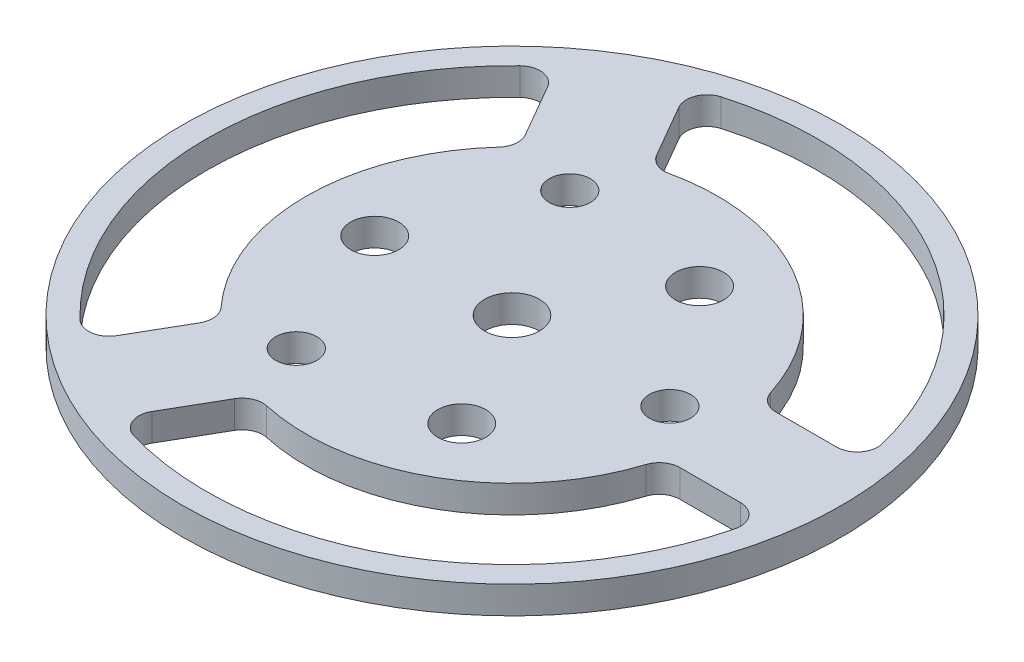
ISO-10303-21;
HEADER;
FILE_DESCRIPTION(('STEP AP214'),'2;1');
FILE_NAME('part.step','',(''),(''),'','','');
FILE_SCHEMA(('AUTOMOTIVE_DESIGN { 1 0 10303 214 1 1 1 1 }'));
ENDSEC;
DATA;
#1=APPLICATION_CONTEXT('core data for automotive mechanical design processes');
#2=APPLICATION_PROTOCOL_DEFINITION('international standard','automotive_design',2000,#1);
#3=PRODUCT_CONTEXT('',#1,'mechanical');
#4=PRODUCT('Part','Part','',(#3));
#5=PRODUCT_RELATED_PRODUCT_CATEGORY('part','',(#4));
#6=PRODUCT_DEFINITION_FORMATION('','',#4);
#7=PRODUCT_DEFINITION_CONTEXT('part definition',#1,'design');
#8=PRODUCT_DEFINITION('design','',#6,#7);
#9=PRODUCT_DEFINITION_SHAPE('','',#8);
#10=(LENGTH_UNIT() NAMED_UNIT(*) SI_UNIT(.MILLI.,.METRE.));
#11=(NAMED_UNIT(*) PLANE_ANGLE_UNIT() SI_UNIT($,.RADIAN.));
#12=(NAMED_UNIT(*) SI_UNIT($,.STERADIAN.) SOLID_ANGLE_UNIT());
#13=UNCERTAINTY_MEASURE_WITH_UNIT(LENGTH_MEASURE(1.E-05),#10,'distance_accuracy_value','');
#14=(GEOMETRIC_REPRESENTATION_CONTEXT(3) GLOBAL_UNCERTAINTY_ASSIGNED_CONTEXT((#13)) GLOBAL_UNIT_ASSIGNED_CONTEXT((#10,
#11,#12)) REPRESENTATION_CONTEXT('',''));
#15=CARTESIAN_POINT('',(0.,0.,0.));
#16=DIRECTION('',(0.,0.,1.));
#17=DIRECTION('',(1.,0.,0.));
#18=AXIS2_PLACEMENT_3D('',#15,#16,#17);
#19=CARTESIAN_POINT('',(0.,2.,0.));
#20=DIRECTION('',(0.,1.,0.));
#21=DIRECTION('',(0.,0.,1.));
#22=AXIS2_PLACEMENT_3D('',#19,#20,#21);
#23=PLANE('',#22);
#24=CARTESIAN_POINT('',(5.,2.,-8.66025403784439));
#25=DIRECTION('',(0.,1.,0.));
#26=DIRECTION('',(0.,0.,1.));
#27=AXIS2_PLACEMENT_3D('',#24,#25,#26);
#28=CIRCLE('',#27,1.75);
#29=CARTESIAN_POINT('',(5.,2.,-6.91025403784439));
#30=VERTEX_POINT('',#29);
#31=EDGE_CURVE('E365',#30,#30,#28,.T.);
#32=ORIENTED_EDGE('',*,*,#31,.F.);
#33=EDGE_LOOP('',(#32));
#34=FACE_BOUND('',#33,.T.);
#35=CARTESIAN_POINT('',(5.0000000000005,2.,8.66025403784439));
#36=DIRECTION('',(0.,1.,0.));
#37=DIRECTION('',(0.,0.,1.));
#38=AXIS2_PLACEMENT_3D('',#35,#36,#37);
#39=CIRCLE('',#38,1.75000000000014);
#40=CARTESIAN_POINT('',(5.0000000000005,2.,10.4102540378445));
#41=VERTEX_POINT('',#40);
#42=EDGE_CURVE('E536',#41,#41,#39,.T.);
#43=ORIENTED_EDGE('',*,*,#42,.F.);
#44=EDGE_LOOP('',(#43));
#45=FACE_BOUND('',#44,.T.);
#46=CARTESIAN_POINT('',(-9.99999999999975,2.,4.32252444309614E-13));
#47=DIRECTION('',(0.,1.,0.));
#48=DIRECTION('',(0.,0.,1.));
#49=AXIS2_PLACEMENT_3D('',#46,#47,#48);
#50=CIRCLE('',#49,1.75000000000053);
#51=CARTESIAN_POINT('',(-9.99999999999975,2.,1.75000000000096));
#52=VERTEX_POINT('',#51);
#53=EDGE_CURVE('E533',#52,#52,#50,.T.);
#54=ORIENTED_EDGE('',*,*,#53,.F.);
#55=EDGE_LOOP('',(#54));
#56=FACE_BOUND('',#55,.T.);
#57=CARTESIAN_POINT('',(0.,2.,0.));
#58=DIRECTION('',(0.,1.,0.));
#59=DIRECTION('',(0.,0.,1.));
#60=AXIS2_PLACEMENT_3D('',#57,#58,#59);
#61=CIRCLE('',#60,22.25);
#62=CARTESIAN_POINT('',(21.5943835085545,2.,-5.36144578313253));
#63=VERTEX_POINT('',#62);
#64=CARTESIAN_POINT('',(-6.15404350507153,2.,-21.3820075890382));
#65=VERTEX_POINT('',#64);
#66=EDGE_CURVE('E370',#63,#65,#61,.T.);
#67=ORIENTED_EDGE('',*,*,#66,.F.);
#68=CARTESIAN_POINT('',(20.1385823731463,2.,-5.));
#69=DIRECTION('',(0.,1.,0.));
#70=DIRECTION('',(0.,0.,1.));
#71=AXIS2_PLACEMENT_3D('',#68,#69,#70);
#72=CIRCLE('',#71,1.5);
#73=CARTESIAN_POINT('',(20.1385823731463,2.,-3.5));
#74=VERTEX_POINT('',#73);
#75=EDGE_CURVE('E331',#63,#74,#72,.F.);
#76=ORIENTED_EDGE('',*,*,#75,.T.);
#77=DIRECTION('',(1.,0.,0.));
#78=VECTOR('',#77,1.);
#79=CARTESIAN_POINT('',(21.9729947890587,2.,-3.5));
#80=LINE('',#79,#78);
#81=CARTESIAN_POINT('',(15.7241851935164,2.,-3.5));
#82=VERTEX_POINT('',#81);
#83=EDGE_CURVE('E388',#82,#74,#80,.T.);
#84=ORIENTED_EDGE('',*,*,#83,.F.);
#85=CARTESIAN_POINT('',(15.7241851935164,2.,-5.));
#86=DIRECTION('',(0.,1.,0.));
#87=DIRECTION('',(0.,0.,1.));
#88=AXIS2_PLACEMENT_3D('',#85,#86,#87);
#89=CIRCLE('',#88,1.5);
#90=CARTESIAN_POINT('',(14.2947138122876,2.,-4.54545454545454));
#91=VERTEX_POINT('',#90);
#92=EDGE_CURVE('E343',#82,#91,#89,.F.);
#93=ORIENTED_EDGE('',*,*,#92,.T.);
#94=CARTESIAN_POINT('',(0.,2.,0.));
#95=DIRECTION('',(0.,-1.,0.));
#96=DIRECTION('',(0.,0.,1.));
#97=AXIS2_PLACEMENT_3D('',#94,#95,#96);
#98=CIRCLE('',#97,15.);
#99=CARTESIAN_POINT('',(-3.21087779803273,2.,-14.6523125739967));
#100=VERTEX_POINT('',#99);
#101=EDGE_CURVE('E380',#100,#91,#98,.T.);
#102=ORIENTED_EDGE('',*,*,#101,.F.);
#103=CARTESIAN_POINT('',(-3.53196557783601,2.,-16.1175438313963));
#104=DIRECTION('',(0.,1.,0.));
#105=DIRECTION('',(0.,0.,1.));
#106=AXIS2_PLACEMENT_3D('',#103,#104,#105);
#107=CIRCLE('',#106,1.5);
#108=CARTESIAN_POINT('',(-4.83100368351267,2.,-15.3675438313963));
#109=VERTEX_POINT('',#108);
#110=EDGE_CURVE('E339',#100,#109,#107,.F.);
#111=ORIENTED_EDGE('',*,*,#110,.T.);
#112=DIRECTION('',(0.5,0.,0.866025403784438));
#113=VECTOR('',#112,1.);
#114=CARTESIAN_POINT('',(-7.95540848128382,2.,-20.7791716845479));
#115=LINE('',#114,#113);
#116=CARTESIAN_POINT('',(-7.03820227332764,2.,-19.1905239313502));
#117=VERTEX_POINT('',#116);
#118=EDGE_CURVE('E374',#117,#109,#115,.T.);
#119=ORIENTED_EDGE('',*,*,#118,.F.);
#120=CARTESIAN_POINT('',(-5.73916416765098,2.,-19.9405239313502));
#121=DIRECTION('',(0.,1.,0.));
#122=DIRECTION('',(0.,0.,1.));
#123=AXIS2_PLACEMENT_3D('',#120,#121,#122);
#124=CIRCLE('',#123,1.5);
#125=EDGE_CURVE('E323',#117,#65,#124,.F.);
#126=ORIENTED_EDGE('',*,*,#125,.T.);
#127=EDGE_LOOP('',(#67,#76,#84,#93,#102,#111,#119,#126));
#128=FACE_BOUND('',#127,.T.);
#129=CARTESIAN_POINT('',(0.,2.,0.));
#130=DIRECTION('',(0.,1.,0.));
#131=DIRECTION('',(0.,0.,1.));
#132=AXIS2_PLACEMENT_3D('',#129,#130,#131);
#133=CIRCLE('',#132,22.25);
#134=CARTESIAN_POINT('',(-15.440340003483,2.,-16.0205618059057));
#135=VERTEX_POINT('',#134);
#136=CARTESIAN_POINT('',(-15.440340003483,2.,16.0205618059057));
#137=VERTEX_POINT('',#136);
#138=EDGE_CURVE('E519',#135,#137,#133,.T.);
#139=ORIENTED_EDGE('',*,*,#138,.F.);
#140=CARTESIAN_POINT('',(-14.3994182054954,2.,-14.9405239313502));
#141=DIRECTION('',(0.,1.,0.));
#142=DIRECTION('',(0.,0.,1.));
#143=AXIS2_PLACEMENT_3D('',#140,#141,#142);
#144=CIRCLE('',#143,1.5);
#145=CARTESIAN_POINT('',(-13.1003800998187,2.,-15.6905239313502));
#146=VERTEX_POINT('',#145);
#147=EDGE_CURVE('E48',#135,#146,#144,.F.);
#148=ORIENTED_EDGE('',*,*,#147,.T.);
#149=DIRECTION('',(-0.499999999999998,0.,-0.86602540378444));
#150=VECTOR('',#149,1.);
#151=CARTESIAN_POINT('',(-14.0175863077749,2.,-17.2791716845479));
#152=LINE('',#151,#150);
#153=CARTESIAN_POINT('',(-10.8931815100037,2.,-11.8675438313963));
#154=VERTEX_POINT('',#153);
#155=EDGE_CURVE('E494',#154,#146,#152,.T.);
#156=ORIENTED_EDGE('',*,*,#155,.F.);
#157=CARTESIAN_POINT('',(-12.1922196156804,2.,-11.1175438313963));
#158=DIRECTION('',(0.,1.,0.));
#159=DIRECTION('',(0.,0.,1.));
#160=AXIS2_PLACEMENT_3D('',#157,#158,#159);
#161=CIRCLE('',#160,1.5);
#162=CARTESIAN_POINT('',(-11.0838360142549,2.,-10.1068580285421));
#163=VERTEX_POINT('',#162);
#164=EDGE_CURVE('E358',#154,#163,#161,.F.);
#165=ORIENTED_EDGE('',*,*,#164,.T.);
#166=CARTESIAN_POINT('',(0.,2.,0.));
#167=DIRECTION('',(0.,-1.,0.));
#168=DIRECTION('',(0.,0.,1.));
#169=AXIS2_PLACEMENT_3D('',#166,#167,#168);
#170=CIRCLE('',#169,15.);
#171=CARTESIAN_POINT('',(-11.0838360142549,2.,10.1068580285421));
#172=VERTEX_POINT('',#171);
#173=EDGE_CURVE('E500',#172,#163,#170,.T.);
#174=ORIENTED_EDGE('',*,*,#173,.F.);
#175=CARTESIAN_POINT('',(-12.1922196156804,2.,11.1175438313963));
#176=DIRECTION('',(0.,1.,0.));
#177=DIRECTION('',(0.,0.,1.));
#178=AXIS2_PLACEMENT_3D('',#175,#176,#177);
#179=CIRCLE('',#178,1.5);
#180=CARTESIAN_POINT('',(-10.8931815100037,2.,11.8675438313963));
#181=VERTEX_POINT('',#180);
#182=EDGE_CURVE('E354',#172,#181,#179,.F.);
#183=ORIENTED_EDGE('',*,*,#182,.T.);
#184=DIRECTION('',(0.499999999999999,0.,-0.866025403784439));
#185=VECTOR('',#184,1.);
#186=CARTESIAN_POINT('',(-14.0175863077749,2.,17.2791716845479));
#187=LINE('',#186,#185);
#188=CARTESIAN_POINT('',(-13.1003800998187,2.,15.6905239313502));
#189=VERTEX_POINT('',#188);
#190=EDGE_CURVE('E505',#189,#181,#187,.T.);
#191=ORIENTED_EDGE('',*,*,#190,.F.);
#192=CARTESIAN_POINT('',(-14.3994182054954,2.,14.9405239313502));
#193=DIRECTION('',(0.,1.,0.));
#194=DIRECTION('',(0.,0.,1.));
#195=AXIS2_PLACEMENT_3D('',#192,#193,#194);
#196=CIRCLE('',#195,1.5);
#197=EDGE_CURVE('E335',#189,#137,#196,.F.);
#198=ORIENTED_EDGE('',*,*,#197,.T.);
#199=EDGE_LOOP('',(#139,#148,#156,#165,#174,#183,#191,#198));
#200=FACE_BOUND('',#199,.T.);
#201=CARTESIAN_POINT('',(0.,2.,0.));
#202=DIRECTION('',(0.,1.,0.));
#203=DIRECTION('',(0.,0.,1.));
#204=AXIS2_PLACEMENT_3D('',#201,#202,#203);
#205=CIRCLE('',#204,22.25);
#206=CARTESIAN_POINT('',(-6.15404350507152,2.,21.3820075890382));
#207=VERTEX_POINT('',#206);
#208=CARTESIAN_POINT('',(21.5943835085545,2.,5.36144578313253));
#209=VERTEX_POINT('',#208);
#210=EDGE_CURVE('E398',#207,#209,#205,.T.);
#211=ORIENTED_EDGE('',*,*,#210,.F.);
#212=CARTESIAN_POINT('',(-5.73916416765096,2.,19.9405239313502));
#213=DIRECTION('',(0.,1.,0.));
#214=DIRECTION('',(0.,0.,1.));
#215=AXIS2_PLACEMENT_3D('',#212,#213,#214);
#216=CIRCLE('',#215,1.5);
#217=CARTESIAN_POINT('',(-7.03820227332762,2.,19.1905239313502));
#218=VERTEX_POINT('',#217);
#219=EDGE_CURVE('E229',#207,#218,#216,.F.);
#220=ORIENTED_EDGE('',*,*,#219,.T.);
#221=DIRECTION('',(-0.5,0.,0.866025403784439));
#222=VECTOR('',#221,1.);
#223=CARTESIAN_POINT('',(-7.9554084812838,2.,20.7791716845479));
#224=LINE('',#223,#222);
#225=CARTESIAN_POINT('',(-4.83100368351266,2.,15.3675438313963));
#226=VERTEX_POINT('',#225);
#227=EDGE_CURVE('E220',#226,#218,#224,.T.);
#228=ORIENTED_EDGE('',*,*,#227,.F.);
#229=CARTESIAN_POINT('',(-3.531965577836,2.,16.1175438313963));
#230=DIRECTION('',(0.,1.,0.));
#231=DIRECTION('',(0.,0.,1.));
#232=AXIS2_PLACEMENT_3D('',#229,#230,#231);
#233=CIRCLE('',#232,1.5);
#234=CARTESIAN_POINT('',(-3.21087779803272,2.,14.6523125739967));
#235=VERTEX_POINT('',#234);
#236=EDGE_CURVE('E203',#226,#235,#233,.F.);
#237=ORIENTED_EDGE('',*,*,#236,.T.);
#238=CARTESIAN_POINT('',(0.,2.,0.));
#239=DIRECTION('',(0.,-1.,0.));
#240=DIRECTION('',(0.,0.,1.));
#241=AXIS2_PLACEMENT_3D('',#238,#239,#240);
#242=CIRCLE('',#241,15.);
#243=CARTESIAN_POINT('',(14.2947138122876,2.,4.54545454545454));
#244=VERTEX_POINT('',#243);
#245=EDGE_CURVE('E231',#244,#235,#242,.T.);
#246=ORIENTED_EDGE('',*,*,#245,.F.);
#247=CARTESIAN_POINT('',(15.7241851935164,2.,5.));
#248=DIRECTION('',(0.,1.,0.));
#249=DIRECTION('',(0.,0.,1.));
#250=AXIS2_PLACEMENT_3D('',#247,#248,#249);
#251=CIRCLE('',#250,1.5);
#252=CARTESIAN_POINT('',(15.7241851935164,2.,3.5));
#253=VERTEX_POINT('',#252);
#254=EDGE_CURVE('E327',#244,#253,#251,.F.);
#255=ORIENTED_EDGE('',*,*,#254,.T.);
#256=DIRECTION('',(-1.,0.,0.));
#257=VECTOR('',#256,1.);
#258=CARTESIAN_POINT('',(21.9729947890587,2.,3.5));
#259=LINE('',#258,#257);
#260=CARTESIAN_POINT('',(20.1385823731463,2.,3.5));
#261=VERTEX_POINT('',#260);
#262=EDGE_CURVE('E236',#261,#253,#259,.T.);
#263=ORIENTED_EDGE('',*,*,#262,.F.);
#264=CARTESIAN_POINT('',(20.1385823731463,2.,5.));
#265=DIRECTION('',(0.,1.,0.));
#266=DIRECTION('',(0.,0.,1.));
#267=AXIS2_PLACEMENT_3D('',#264,#265,#266);
#268=CIRCLE('',#267,1.5);
#269=EDGE_CURVE('E350',#261,#209,#268,.F.);
#270=ORIENTED_EDGE('',*,*,#269,.T.);
#271=EDGE_LOOP('',(#211,#220,#228,#237,#246,#255,#263,#270));
#272=FACE_BOUND('',#271,.T.);
#273=CARTESIAN_POINT('',(-5.75000000000005,2.,9.95929214352102));
#274=DIRECTION('',(0.,1.,0.));
#275=DIRECTION('',(0.,0.,1.));
#276=AXIS2_PLACEMENT_3D('',#273,#274,#275);
#277=CIRCLE('',#276,1.5);
#278=CARTESIAN_POINT('',(-5.75000000000005,2.,11.459292143521));
#279=VERTEX_POINT('',#278);
#280=EDGE_CURVE('E247',#279,#279,#277,.T.);
#281=ORIENTED_EDGE('',*,*,#280,.F.);
#282=EDGE_LOOP('',(#281));
#283=FACE_BOUND('',#282,.T.);
#284=CARTESIAN_POINT('',(0.,2.,0.));
#285=DIRECTION('',(0.,1.,0.));
#286=DIRECTION('',(0.,0.,1.));
#287=AXIS2_PLACEMENT_3D('',#284,#285,#286);
#288=CIRCLE('',#287,2.);
#289=CARTESIAN_POINT('',(0.,2.,2.));
#290=VERTEX_POINT('',#289);
#291=EDGE_CURVE('E259',#290,#290,#288,.T.);
#292=ORIENTED_EDGE('',*,*,#291,.F.);
#293=EDGE_LOOP('',(#292));
#294=FACE_BOUND('',#293,.T.);
#295=CARTESIAN_POINT('',(0.,2.,0.));
#296=DIRECTION('',(0.,1.,0.));
#297=DIRECTION('',(0.,0.,1.));
#298=AXIS2_PLACEMENT_3D('',#295,#296,#297);
#299=CIRCLE('',#298,24.);
#300=CARTESIAN_POINT('',(0.,2.,24.));
#301=VERTEX_POINT('',#300);
#302=EDGE_CURVE('E265',#301,#301,#299,.T.);
#303=ORIENTED_EDGE('',*,*,#302,.T.);
#304=EDGE_LOOP('',(#303));
#305=FACE_BOUND('',#304,.T.);
#306=CARTESIAN_POINT('',(11.5,2.,0.));
#307=DIRECTION('',(0.,1.,0.));
#308=DIRECTION('',(0.,0.,1.));
#309=AXIS2_PLACEMENT_3D('',#306,#307,#308);
#310=CIRCLE('',#309,1.5);
#311=CARTESIAN_POINT('',(11.5,2.,1.5));
#312=VERTEX_POINT('',#311);
#313=EDGE_CURVE('E253',#312,#312,#310,.T.);
#314=ORIENTED_EDGE('',*,*,#313,.F.);
#315=EDGE_LOOP('',(#314));
#316=FACE_BOUND('',#315,.T.);
#317=CARTESIAN_POINT('',(-5.74999999999991,2.,-9.95929214352109));
#318=DIRECTION('',(0.,1.,0.));
#319=DIRECTION('',(0.,0.,1.));
#320=AXIS2_PLACEMENT_3D('',#317,#318,#319);
#321=CIRCLE('',#320,1.5);
#322=CARTESIAN_POINT('',(-5.74999999999991,2.,-8.4592921435211));
#323=VERTEX_POINT('',#322);
#324=EDGE_CURVE('E240',#323,#323,#321,.T.);
#325=ORIENTED_EDGE('',*,*,#324,.F.);
#326=EDGE_LOOP('',(#325));
#327=FACE_BOUND('',#326,.T.);
#328=ADVANCED_FACE('F39',(#34,#45,#56,#128,#200,#272,#283,#294,#305,#316,#327),#23,.T.);
#329=CARTESIAN_POINT('',(0.,0.,0.));
#330=DIRECTION('',(0.,1.,0.));
#331=DIRECTION('',(0.,0.,1.));
#332=AXIS2_PLACEMENT_3D('',#329,#330,#331);
#333=PLANE('',#332);
#334=CARTESIAN_POINT('',(5.,0.,-8.66025403784439));
#335=DIRECTION('',(0.,1.,0.));
#336=DIRECTION('',(0.,0.,1.));
#337=AXIS2_PLACEMENT_3D('',#334,#335,#336);
#338=CIRCLE('',#337,1.75);
#339=CARTESIAN_POINT('',(5.,0.,-6.91025403784439));
#340=VERTEX_POINT('',#339);
#341=EDGE_CURVE('E43',#340,#340,#338,.T.);
#342=ORIENTED_EDGE('',*,*,#341,.T.);
#343=EDGE_LOOP('',(#342));
#344=FACE_BOUND('',#343,.T.);
#345=CARTESIAN_POINT('',(5.0000000000005,0.,8.66025403784439));
#346=DIRECTION('',(0.,1.,0.));
#347=DIRECTION('',(0.,0.,1.));
#348=AXIS2_PLACEMENT_3D('',#345,#346,#347);
#349=CIRCLE('',#348,1.75000000000014);
#350=CARTESIAN_POINT('',(5.0000000000005,0.,10.4102540378445));
#351=VERTEX_POINT('',#350);
#352=EDGE_CURVE('E364',#351,#351,#349,.T.);
#353=ORIENTED_EDGE('',*,*,#352,.T.);
#354=EDGE_LOOP('',(#353));
#355=FACE_BOUND('',#354,.T.);
#356=CARTESIAN_POINT('',(-9.99999999999975,0.,4.32252444309614E-13));
#357=DIRECTION('',(0.,1.,0.));
#358=DIRECTION('',(0.,0.,1.));
#359=AXIS2_PLACEMENT_3D('',#356,#357,#358);
#360=CIRCLE('',#359,1.75000000000053);
#361=CARTESIAN_POINT('',(-9.99999999999975,0.,1.75000000000096));
#362=VERTEX_POINT('',#361);
#363=EDGE_CURVE('E362',#362,#362,#360,.T.);
#364=ORIENTED_EDGE('',*,*,#363,.T.);
#365=EDGE_LOOP('',(#364));
#366=FACE_BOUND('',#365,.T.);
#367=CARTESIAN_POINT('',(0.,0.,0.));
#368=DIRECTION('',(0.,-1.,0.));
#369=DIRECTION('',(0.,0.,1.));
#370=AXIS2_PLACEMENT_3D('',#367,#368,#369);
#371=CIRCLE('',#370,15.);
#372=CARTESIAN_POINT('',(-3.21087779803273,0.,-14.6523125739967));
#373=VERTEX_POINT('',#372);
#374=CARTESIAN_POINT('',(14.2947138122876,0.,-4.54545454545454));
#375=VERTEX_POINT('',#374);
#376=EDGE_CURVE('E513',#373,#375,#371,.T.);
#377=ORIENTED_EDGE('',*,*,#376,.T.);
#378=CARTESIAN_POINT('',(15.7241851935164,0.,-5.));
#379=DIRECTION('',(0.,1.,0.));
#380=DIRECTION('',(0.,0.,1.));
#381=AXIS2_PLACEMENT_3D('',#378,#379,#380);
#382=CIRCLE('',#381,1.5);
#383=CARTESIAN_POINT('',(15.7241851935164,0.,-3.5));
#384=VERTEX_POINT('',#383);
#385=EDGE_CURVE('E345',#375,#384,#382,.T.);
#386=ORIENTED_EDGE('',*,*,#385,.T.);
#387=DIRECTION('',(1.,0.,0.));
#388=VECTOR('',#387,1.);
#389=CARTESIAN_POINT('',(21.9729947890587,0.,-3.5));
#390=LINE('',#389,#388);
#391=CARTESIAN_POINT('',(20.1385823731463,0.,-3.5));
#392=VERTEX_POINT('',#391);
#393=EDGE_CURVE('E383',#384,#392,#390,.T.);
#394=ORIENTED_EDGE('',*,*,#393,.T.);
#395=CARTESIAN_POINT('',(20.1385823731463,0.,-5.));
#396=DIRECTION('',(0.,1.,0.));
#397=DIRECTION('',(0.,0.,1.));
#398=AXIS2_PLACEMENT_3D('',#395,#396,#397);
#399=CIRCLE('',#398,1.5);
#400=CARTESIAN_POINT('',(21.5943835085545,0.,-5.36144578313253));
#401=VERTEX_POINT('',#400);
#402=EDGE_CURVE('E333',#392,#401,#399,.T.);
#403=ORIENTED_EDGE('',*,*,#402,.T.);
#404=CARTESIAN_POINT('',(0.,0.,0.));
#405=DIRECTION('',(0.,1.,0.));
#406=DIRECTION('',(0.,0.,1.));
#407=AXIS2_PLACEMENT_3D('',#404,#405,#406);
#408=CIRCLE('',#407,22.25);
#409=CARTESIAN_POINT('',(-6.15404350507153,0.,-21.3820075890382));
#410=VERTEX_POINT('',#409);
#411=EDGE_CURVE('E390',#401,#410,#408,.T.);
#412=ORIENTED_EDGE('',*,*,#411,.T.);
#413=CARTESIAN_POINT('',(-5.73916416765098,0.,-19.9405239313502));
#414=DIRECTION('',(0.,1.,0.));
#415=DIRECTION('',(0.,0.,1.));
#416=AXIS2_PLACEMENT_3D('',#413,#414,#415);
#417=CIRCLE('',#416,1.5);
#418=CARTESIAN_POINT('',(-7.03820227332764,0.,-19.1905239313502));
#419=VERTEX_POINT('',#418);
#420=EDGE_CURVE('E325',#410,#419,#417,.T.);
#421=ORIENTED_EDGE('',*,*,#420,.T.);
#422=DIRECTION('',(0.5,0.,0.866025403784438));
#423=VECTOR('',#422,1.);
#424=CARTESIAN_POINT('',(-7.95540848128382,0.,-20.7791716845479));
#425=LINE('',#424,#423);
#426=CARTESIAN_POINT('',(-4.83100368351267,0.,-15.3675438313963));
#427=VERTEX_POINT('',#426);
#428=EDGE_CURVE('E511',#419,#427,#425,.T.);
#429=ORIENTED_EDGE('',*,*,#428,.T.);
#430=CARTESIAN_POINT('',(-3.53196557783601,0.,-16.1175438313963));
#431=DIRECTION('',(0.,1.,0.));
#432=DIRECTION('',(0.,0.,1.));
#433=AXIS2_PLACEMENT_3D('',#430,#431,#432);
#434=CIRCLE('',#433,1.5);
#435=EDGE_CURVE('E341',#427,#373,#434,.T.);
#436=ORIENTED_EDGE('',*,*,#435,.T.);
#437=EDGE_LOOP('',(#377,#386,#394,#403,#412,#421,#429,#436));
#438=FACE_BOUND('',#437,.T.);
#439=CARTESIAN_POINT('',(0.,0.,0.));
#440=DIRECTION('',(0.,-1.,0.));
#441=DIRECTION('',(0.,0.,1.));
#442=AXIS2_PLACEMENT_3D('',#439,#440,#441);
#443=CIRCLE('',#442,15.);
#444=CARTESIAN_POINT('',(-11.0838360142549,0.,10.1068580285421));
#445=VERTEX_POINT('',#444);
#446=CARTESIAN_POINT('',(-11.0838360142549,0.,-10.1068580285421));
#447=VERTEX_POINT('',#446);
#448=EDGE_CURVE('E529',#445,#447,#443,.T.);
#449=ORIENTED_EDGE('',*,*,#448,.T.);
#450=CARTESIAN_POINT('',(-12.1922196156804,0.,-11.1175438313963));
#451=DIRECTION('',(0.,1.,0.));
#452=DIRECTION('',(0.,0.,1.));
#453=AXIS2_PLACEMENT_3D('',#450,#451,#452);
#454=CIRCLE('',#453,1.5);
#455=CARTESIAN_POINT('',(-10.8931815100037,0.,-11.8675438313963));
#456=VERTEX_POINT('',#455);
#457=EDGE_CURVE('E63',#447,#456,#454,.T.);
#458=ORIENTED_EDGE('',*,*,#457,.T.);
#459=DIRECTION('',(-0.499999999999998,0.,-0.86602540378444));
#460=VECTOR('',#459,1.);
#461=CARTESIAN_POINT('',(-14.0175863077749,0.,-17.2791716845479));
#462=LINE('',#461,#460);
#463=CARTESIAN_POINT('',(-13.1003800998187,0.,-15.6905239313502));
#464=VERTEX_POINT('',#463);
#465=EDGE_CURVE('E400',#456,#464,#462,.T.);
#466=ORIENTED_EDGE('',*,*,#465,.T.);
#467=CARTESIAN_POINT('',(-14.3994182054954,0.,-14.9405239313502));
#468=DIRECTION('',(0.,1.,0.));
#469=DIRECTION('',(0.,0.,1.));
#470=AXIS2_PLACEMENT_3D('',#467,#468,#469);
#471=CIRCLE('',#470,1.5);
#472=CARTESIAN_POINT('',(-15.440340003483,0.,-16.0205618059057));
#473=VERTEX_POINT('',#472);
#474=EDGE_CURVE('E11',#464,#473,#471,.T.);
#475=ORIENTED_EDGE('',*,*,#474,.T.);
#476=CARTESIAN_POINT('',(0.,0.,0.));
#477=DIRECTION('',(0.,1.,0.));
#478=DIRECTION('',(0.,0.,1.));
#479=AXIS2_PLACEMENT_3D('',#476,#477,#478);
#480=CIRCLE('',#479,22.25);
#481=CARTESIAN_POINT('',(-15.440340003483,0.,16.0205618059057));
#482=VERTEX_POINT('',#481);
#483=EDGE_CURVE('E499',#473,#482,#480,.T.);
#484=ORIENTED_EDGE('',*,*,#483,.T.);
#485=CARTESIAN_POINT('',(-14.3994182054954,0.,14.9405239313502));
#486=DIRECTION('',(0.,1.,0.));
#487=DIRECTION('',(0.,0.,1.));
#488=AXIS2_PLACEMENT_3D('',#485,#486,#487);
#489=CIRCLE('',#488,1.5);
#490=CARTESIAN_POINT('',(-13.1003800998187,0.,15.6905239313502));
#491=VERTEX_POINT('',#490);
#492=EDGE_CURVE('E337',#482,#491,#489,.T.);
#493=ORIENTED_EDGE('',*,*,#492,.T.);
#494=DIRECTION('',(0.499999999999999,0.,-0.866025403784439));
#495=VECTOR('',#494,1.);
#496=CARTESIAN_POINT('',(-14.0175863077749,0.,17.2791716845479));
#497=LINE('',#496,#495);
#498=CARTESIAN_POINT('',(-10.8931815100037,0.,11.8675438313963));
#499=VERTEX_POINT('',#498);
#500=EDGE_CURVE('E503',#491,#499,#497,.T.);
#501=ORIENTED_EDGE('',*,*,#500,.T.);
#502=CARTESIAN_POINT('',(-12.1922196156804,0.,11.1175438313963));
#503=DIRECTION('',(0.,1.,0.));
#504=DIRECTION('',(0.,0.,1.));
#505=AXIS2_PLACEMENT_3D('',#502,#503,#504);
#506=CIRCLE('',#505,1.5);
#507=EDGE_CURVE('E356',#499,#445,#506,.T.);
#508=ORIENTED_EDGE('',*,*,#507,.T.);
#509=EDGE_LOOP('',(#449,#458,#466,#475,#484,#493,#501,#508));
#510=FACE_BOUND('',#509,.T.);
#511=CARTESIAN_POINT('',(0.,0.,0.));
#512=DIRECTION('',(0.,-1.,0.));
#513=DIRECTION('',(0.,0.,1.));
#514=AXIS2_PLACEMENT_3D('',#511,#512,#513);
#515=CIRCLE('',#514,15.);
#516=CARTESIAN_POINT('',(14.2947138122876,0.,4.54545454545454));
#517=VERTEX_POINT('',#516);
#518=CARTESIAN_POINT('',(-3.21087779803272,0.,14.6523125739967));
#519=VERTEX_POINT('',#518);
#520=EDGE_CURVE('E394',#517,#519,#515,.T.);
#521=ORIENTED_EDGE('',*,*,#520,.T.);
#522=CARTESIAN_POINT('',(-3.531965577836,0.,16.1175438313963));
#523=DIRECTION('',(0.,1.,0.));
#524=DIRECTION('',(0.,0.,1.));
#525=AXIS2_PLACEMENT_3D('',#522,#523,#524);
#526=CIRCLE('',#525,1.5);
#527=CARTESIAN_POINT('',(-4.83100368351266,0.,15.3675438313963));
#528=VERTEX_POINT('',#527);
#529=EDGE_CURVE('E213',#519,#528,#526,.T.);
#530=ORIENTED_EDGE('',*,*,#529,.T.);
#531=DIRECTION('',(-0.5,0.,0.866025403784439));
#532=VECTOR('',#531,1.);
#533=CARTESIAN_POINT('',(-7.9554084812838,0.,20.7791716845479));
#534=LINE('',#533,#532);
#535=CARTESIAN_POINT('',(-7.03820227332762,0.,19.1905239313502));
#536=VERTEX_POINT('',#535);
#537=EDGE_CURVE('E223',#528,#536,#534,.T.);
#538=ORIENTED_EDGE('',*,*,#537,.T.);
#539=CARTESIAN_POINT('',(-5.73916416765096,0.,19.9405239313502));
#540=DIRECTION('',(0.,1.,0.));
#541=DIRECTION('',(0.,0.,1.));
#542=AXIS2_PLACEMENT_3D('',#539,#540,#541);
#543=CIRCLE('',#542,1.5);
#544=CARTESIAN_POINT('',(-6.15404350507152,0.,21.3820075890382));
#545=VERTEX_POINT('',#544);
#546=EDGE_CURVE('E348',#536,#545,#543,.T.);
#547=ORIENTED_EDGE('',*,*,#546,.T.);
#548=CARTESIAN_POINT('',(0.,0.,0.));
#549=DIRECTION('',(0.,1.,0.));
#550=DIRECTION('',(0.,0.,1.));
#551=AXIS2_PLACEMENT_3D('',#548,#549,#550);
#552=CIRCLE('',#551,22.25);
#553=CARTESIAN_POINT('',(21.5943835085545,0.,5.36144578313253));
#554=VERTEX_POINT('',#553);
#555=EDGE_CURVE('E230',#545,#554,#552,.T.);
#556=ORIENTED_EDGE('',*,*,#555,.T.);
#557=CARTESIAN_POINT('',(20.1385823731463,0.,5.));
#558=DIRECTION('',(0.,1.,0.));
#559=DIRECTION('',(0.,0.,1.));
#560=AXIS2_PLACEMENT_3D('',#557,#558,#559);
#561=CIRCLE('',#560,1.5);
#562=CARTESIAN_POINT('',(20.1385823731463,0.,3.5));
#563=VERTEX_POINT('',#562);
#564=EDGE_CURVE('E352',#554,#563,#561,.T.);
#565=ORIENTED_EDGE('',*,*,#564,.T.);
#566=DIRECTION('',(-1.,0.,0.));
#567=VECTOR('',#566,1.);
#568=CARTESIAN_POINT('',(21.9729947890587,0.,3.5));
#569=LINE('',#568,#567);
#570=CARTESIAN_POINT('',(15.7241851935164,0.,3.5));
#571=VERTEX_POINT('',#570);
#572=EDGE_CURVE('E234',#563,#571,#569,.T.);
#573=ORIENTED_EDGE('',*,*,#572,.T.);
#574=CARTESIAN_POINT('',(15.7241851935164,0.,5.));
#575=DIRECTION('',(0.,1.,0.));
#576=DIRECTION('',(0.,0.,1.));
#577=AXIS2_PLACEMENT_3D('',#574,#575,#576);
#578=CIRCLE('',#577,1.5);
#579=EDGE_CURVE('E329',#571,#517,#578,.T.);
#580=ORIENTED_EDGE('',*,*,#579,.T.);
#581=EDGE_LOOP('',(#521,#530,#538,#547,#556,#565,#573,#580));
#582=FACE_BOUND('',#581,.T.);
#583=CARTESIAN_POINT('',(0.,0.,0.));
#584=DIRECTION('',(0.,1.,0.));
#585=DIRECTION('',(0.,0.,1.));
#586=AXIS2_PLACEMENT_3D('',#583,#584,#585);
#587=CIRCLE('',#586,24.);
#588=CARTESIAN_POINT('',(0.,0.,24.));
#589=VERTEX_POINT('',#588);
#590=EDGE_CURVE('E262',#589,#589,#587,.T.);
#591=ORIENTED_EDGE('',*,*,#590,.F.);
#592=EDGE_LOOP('',(#591));
#593=FACE_BOUND('',#592,.T.);
#594=CARTESIAN_POINT('',(0.,0.,0.));
#595=DIRECTION('',(0.,1.,0.));
#596=DIRECTION('',(0.,0.,1.));
#597=AXIS2_PLACEMENT_3D('',#594,#595,#596);
#598=CIRCLE('',#597,2.);
#599=CARTESIAN_POINT('',(0.,0.,2.));
#600=VERTEX_POINT('',#599);
#601=EDGE_CURVE('E256',#600,#600,#598,.T.);
#602=ORIENTED_EDGE('',*,*,#601,.T.);
#603=EDGE_LOOP('',(#602));
#604=FACE_BOUND('',#603,.T.);
#605=CARTESIAN_POINT('',(11.5,0.,0.));
#606=DIRECTION('',(0.,1.,0.));
#607=DIRECTION('',(0.,0.,1.));
#608=AXIS2_PLACEMENT_3D('',#605,#606,#607);
#609=CIRCLE('',#608,1.5);
#610=CARTESIAN_POINT('',(11.5,0.,1.5));
#611=VERTEX_POINT('',#610);
#612=EDGE_CURVE('E250',#611,#611,#609,.T.);
#613=ORIENTED_EDGE('',*,*,#612,.T.);
#614=EDGE_LOOP('',(#613));
#615=FACE_BOUND('',#614,.T.);
#616=CARTESIAN_POINT('',(-5.75000000000005,0.,9.95929214352102));
#617=DIRECTION('',(0.,1.,0.));
#618=DIRECTION('',(0.,0.,1.));
#619=AXIS2_PLACEMENT_3D('',#616,#617,#618);
#620=CIRCLE('',#619,1.5);
#621=CARTESIAN_POINT('',(-5.75000000000005,0.,11.459292143521));
#622=VERTEX_POINT('',#621);
#623=EDGE_CURVE('E243',#622,#622,#620,.T.);
#624=ORIENTED_EDGE('',*,*,#623,.T.);
#625=EDGE_LOOP('',(#624));
#626=FACE_BOUND('',#625,.T.);
#627=CARTESIAN_POINT('',(-5.74999999999991,0.,-9.95929214352109));
#628=DIRECTION('',(0.,1.,0.));
#629=DIRECTION('',(0.,0.,1.));
#630=AXIS2_PLACEMENT_3D('',#627,#628,#629);
#631=CIRCLE('',#630,1.5);
#632=CARTESIAN_POINT('',(-5.74999999999991,0.,-8.4592921435211));
#633=VERTEX_POINT('',#632);
#634=EDGE_CURVE('E244',#633,#633,#631,.T.);
#635=ORIENTED_EDGE('',*,*,#634,.T.);
#636=EDGE_LOOP('',(#635));
#637=FACE_BOUND('',#636,.T.);
#638=ADVANCED_FACE('F414',(#344,#355,#366,#438,#510,#582,#593,#604,#615,#626,#637),#333,.F.);
#639=CARTESIAN_POINT('',(0.,2.,0.));
#640=DIRECTION('',(0.,-1.,0.));
#641=DIRECTION('',(0.,0.,-1.));
#642=AXIS2_PLACEMENT_3D('',#639,#640,#641);
#643=CYLINDRICAL_SURFACE('',#642,24.);
#644=ORIENTED_EDGE('',*,*,#302,.F.);
#645=EDGE_LOOP('',(#644));
#646=FACE_BOUND('',#645,.T.);
#647=ORIENTED_EDGE('',*,*,#590,.T.);
#648=EDGE_LOOP('',(#647));
#649=FACE_BOUND('',#648,.T.);
#650=ADVANCED_FACE('F435',(#646,#649),#643,.T.);
#651=CARTESIAN_POINT('',(0.,2.,0.));
#652=DIRECTION('',(0.,-1.,0.));
#653=DIRECTION('',(0.,0.,-1.));
#654=AXIS2_PLACEMENT_3D('',#651,#652,#653);
#655=CYLINDRICAL_SURFACE('',#654,2.);
#656=ORIENTED_EDGE('',*,*,#291,.T.);
#657=EDGE_LOOP('',(#656));
#658=FACE_BOUND('',#657,.T.);
#659=ORIENTED_EDGE('',*,*,#601,.F.);
#660=EDGE_LOOP('',(#659));
#661=FACE_BOUND('',#660,.T.);
#662=ADVANCED_FACE('F440',(#658,#661),#655,.F.);
#663=CARTESIAN_POINT('',(11.5,2.,0.));
#664=DIRECTION('',(0.,-1.,0.));
#665=DIRECTION('',(0.,0.,-1.));
#666=AXIS2_PLACEMENT_3D('',#663,#664,#665);
#667=CYLINDRICAL_SURFACE('',#666,1.5);
#668=ORIENTED_EDGE('',*,*,#313,.T.);
#669=EDGE_LOOP('',(#668));
#670=FACE_BOUND('',#669,.T.);
#671=ORIENTED_EDGE('',*,*,#612,.F.);
#672=EDGE_LOOP('',(#671));
#673=FACE_BOUND('',#672,.T.);
#674=ADVANCED_FACE('F681',(#670,#673),#667,.F.);
#675=CARTESIAN_POINT('',(-5.75000000000005,2.,9.95929214352102));
#676=DIRECTION('',(0.,-1.,0.));
#677=DIRECTION('',(0.,0.,-1.));
#678=AXIS2_PLACEMENT_3D('',#675,#676,#677);
#679=CYLINDRICAL_SURFACE('',#678,1.5);
#680=ORIENTED_EDGE('',*,*,#280,.T.);
#681=EDGE_LOOP('',(#680));
#682=FACE_BOUND('',#681,.T.);
#683=ORIENTED_EDGE('',*,*,#623,.F.);
#684=EDGE_LOOP('',(#683));
#685=FACE_BOUND('',#684,.T.);
#686=ADVANCED_FACE('F688',(#682,#685),#679,.F.);
#687=CARTESIAN_POINT('',(-5.74999999999991,2.,-9.95929214352109));
#688=DIRECTION('',(0.,-1.,0.));
#689=DIRECTION('',(0.,0.,-1.));
#690=AXIS2_PLACEMENT_3D('',#687,#688,#689);
#691=CYLINDRICAL_SURFACE('',#690,1.5);
#692=ORIENTED_EDGE('',*,*,#324,.T.);
#693=EDGE_LOOP('',(#692));
#694=FACE_BOUND('',#693,.T.);
#695=ORIENTED_EDGE('',*,*,#634,.F.);
#696=EDGE_LOOP('',(#695));
#697=FACE_BOUND('',#696,.T.);
#698=ADVANCED_FACE('F695',(#694,#697),#691,.F.);
#699=CARTESIAN_POINT('',(0.,0.,0.));
#700=DIRECTION('',(0.,1.,0.));
#701=DIRECTION('',(0.,0.,1.));
#702=AXIS2_PLACEMENT_3D('',#699,#700,#701);
#703=CYLINDRICAL_SURFACE('',#702,22.25);
#704=ORIENTED_EDGE('',*,*,#555,.F.);
#705=DIRECTION('',(0.,1.,0.));
#706=VECTOR('',#705,1.);
#707=CARTESIAN_POINT('',(-6.15404350507151,0.,21.3820075890382));
#708=LINE('',#707,#706);
#709=EDGE_CURVE('E311',#545,#207,#708,.T.);
#710=ORIENTED_EDGE('',*,*,#709,.T.);
#711=ORIENTED_EDGE('',*,*,#210,.T.);
#712=DIRECTION('',(0.,1.,0.));
#713=VECTOR('',#712,1.);
#714=CARTESIAN_POINT('',(21.5943835085545,0.,5.36144578313253));
#715=LINE('',#714,#713);
#716=EDGE_CURVE('E309',#209,#554,#715,.F.);
#717=ORIENTED_EDGE('',*,*,#716,.T.);
#718=EDGE_LOOP('',(#704,#710,#711,#717));
#719=FACE_BOUND('',#718,.T.);
#720=ADVANCED_FACE('F426',(#719),#703,.F.);
#721=CARTESIAN_POINT('',(-7.9554084812838,0.,20.7791716845479));
#722=DIRECTION('',(-0.866025403784439,0.,-0.5));
#723=DIRECTION('',(-0.5,0.,0.866025403784439));
#724=AXIS2_PLACEMENT_3D('',#721,#722,#723);
#725=PLANE('',#724);
#726=ORIENTED_EDGE('',*,*,#537,.F.);
#727=DIRECTION('',(0.,-1.,0.));
#728=VECTOR('',#727,1.);
#729=CARTESIAN_POINT('',(-4.83100368351266,2.,15.3675438313963));
#730=LINE('',#729,#728);
#731=EDGE_CURVE('E207',#528,#226,#730,.F.);
#732=ORIENTED_EDGE('',*,*,#731,.T.);
#733=ORIENTED_EDGE('',*,*,#227,.T.);
#734=DIRECTION('',(0.,-1.,0.));
#735=VECTOR('',#734,1.);
#736=CARTESIAN_POINT('',(-7.03820227332762,0.,19.1905239313502));
#737=LINE('',#736,#735);
#738=EDGE_CURVE('E225',#218,#536,#737,.T.);
#739=ORIENTED_EDGE('',*,*,#738,.T.);
#740=EDGE_LOOP('',(#726,#732,#733,#739));
#741=FACE_BOUND('',#740,.T.);
#742=ADVANCED_FACE('F219',(#741),#725,.F.);
#743=CARTESIAN_POINT('',(0.,0.,0.));
#744=DIRECTION('',(0.,1.,0.));
#745=DIRECTION('',(0.,0.,1.));
#746=AXIS2_PLACEMENT_3D('',#743,#744,#745);
#747=CYLINDRICAL_SURFACE('',#746,15.);
#748=ORIENTED_EDGE('',*,*,#245,.T.);
#749=DIRECTION('',(0.,1.,0.));
#750=VECTOR('',#749,1.);
#751=CARTESIAN_POINT('',(-3.21087779803272,0.,14.6523125739967));
#752=LINE('',#751,#750);
#753=EDGE_CURVE('E208',#235,#519,#752,.F.);
#754=ORIENTED_EDGE('',*,*,#753,.T.);
#755=ORIENTED_EDGE('',*,*,#520,.F.);
#756=DIRECTION('',(0.,1.,0.));
#757=VECTOR('',#756,1.);
#758=CARTESIAN_POINT('',(14.2947138122876,0.,4.54545454545454));
#759=LINE('',#758,#757);
#760=EDGE_CURVE('E224',#517,#244,#759,.T.);
#761=ORIENTED_EDGE('',*,*,#760,.T.);
#762=EDGE_LOOP('',(#748,#754,#755,#761));
#763=FACE_BOUND('',#762,.T.);
#764=ADVANCED_FACE('F417',(#763),#747,.T.);
#765=CARTESIAN_POINT('',(21.9729947890587,0.,3.5));
#766=DIRECTION('',(0.,0.,-1.));
#767=DIRECTION('',(-1.,0.,0.));
#768=AXIS2_PLACEMENT_3D('',#765,#766,#767);
#769=PLANE('',#768);
#770=ORIENTED_EDGE('',*,*,#262,.T.);
#771=DIRECTION('',(0.,-1.,0.));
#772=VECTOR('',#771,1.);
#773=CARTESIAN_POINT('',(15.7241851935164,0.,3.5));
#774=LINE('',#773,#772);
#775=EDGE_CURVE('E287',#253,#571,#774,.T.);
#776=ORIENTED_EDGE('',*,*,#775,.T.);
#777=ORIENTED_EDGE('',*,*,#572,.F.);
#778=DIRECTION('',(0.,-1.,0.));
#779=VECTOR('',#778,1.);
#780=CARTESIAN_POINT('',(20.1385823731463,2.,3.5));
#781=LINE('',#780,#779);
#782=EDGE_CURVE('E284',#563,#261,#781,.F.);
#783=ORIENTED_EDGE('',*,*,#782,.T.);
#784=EDGE_LOOP('',(#770,#776,#777,#783));
#785=FACE_BOUND('',#784,.T.);
#786=ADVANCED_FACE('F405',(#785),#769,.F.);
#787=CARTESIAN_POINT('',(0.,0.,0.));
#788=DIRECTION('',(0.,1.,0.));
#789=DIRECTION('',(0.,0.,1.));
#790=AXIS2_PLACEMENT_3D('',#787,#788,#789);
#791=CYLINDRICAL_SURFACE('',#790,22.25);
#792=ORIENTED_EDGE('',*,*,#138,.T.);
#793=DIRECTION('',(0.,1.,0.));
#794=VECTOR('',#793,1.);
#795=CARTESIAN_POINT('',(-15.440340003483,0.,16.0205618059057));
#796=LINE('',#795,#794);
#797=EDGE_CURVE('E302',#137,#482,#796,.F.);
#798=ORIENTED_EDGE('',*,*,#797,.T.);
#799=ORIENTED_EDGE('',*,*,#483,.F.);
#800=DIRECTION('',(0.,1.,0.));
#801=VECTOR('',#800,1.);
#802=CARTESIAN_POINT('',(-15.440340003483,0.,-16.0205618059057));
#803=LINE('',#802,#801);
#804=EDGE_CURVE('E299',#473,#135,#803,.T.);
#805=ORIENTED_EDGE('',*,*,#804,.T.);
#806=EDGE_LOOP('',(#792,#798,#799,#805));
#807=FACE_BOUND('',#806,.T.);
#808=ADVANCED_FACE('F424',(#807),#791,.F.);
#809=CARTESIAN_POINT('',(-14.0175863077749,0.,-17.2791716845479));
#810=DIRECTION('',(0.86602540378444,0.,-0.499999999999998));
#811=DIRECTION('',(-0.499999999999998,0.,-0.86602540378444));
#812=AXIS2_PLACEMENT_3D('',#809,#810,#811);
#813=PLANE('',#812);
#814=ORIENTED_EDGE('',*,*,#465,.F.);
#815=DIRECTION('',(0.,-1.,0.));
#816=VECTOR('',#815,1.);
#817=CARTESIAN_POINT('',(-10.8931815100037,2.,-11.8675438313963));
#818=LINE('',#817,#816);
#819=EDGE_CURVE('E214',#456,#154,#818,.F.);
#820=ORIENTED_EDGE('',*,*,#819,.T.);
#821=ORIENTED_EDGE('',*,*,#155,.T.);
#822=DIRECTION('',(0.,-1.,0.));
#823=VECTOR('',#822,1.);
#824=CARTESIAN_POINT('',(-13.1003800998187,0.,-15.6905239313502));
#825=LINE('',#824,#823);
#826=EDGE_CURVE('E56',#146,#464,#825,.T.);
#827=ORIENTED_EDGE('',*,*,#826,.T.);
#828=EDGE_LOOP('',(#814,#820,#821,#827));
#829=FACE_BOUND('',#828,.T.);
#830=ADVANCED_FACE('F493',(#829),#813,.F.);
#831=CARTESIAN_POINT('',(0.,0.,0.));
#832=DIRECTION('',(0.,1.,0.));
#833=DIRECTION('',(0.,0.,1.));
#834=AXIS2_PLACEMENT_3D('',#831,#832,#833);
#835=CYLINDRICAL_SURFACE('',#834,15.);
#836=ORIENTED_EDGE('',*,*,#448,.F.);
#837=DIRECTION('',(0.,1.,0.));
#838=VECTOR('',#837,1.);
#839=CARTESIAN_POINT('',(-11.0838360142549,0.,10.1068580285421));
#840=LINE('',#839,#838);
#841=EDGE_CURVE('E316',#445,#172,#840,.T.);
#842=ORIENTED_EDGE('',*,*,#841,.T.);
#843=ORIENTED_EDGE('',*,*,#173,.T.);
#844=DIRECTION('',(0.,1.,0.));
#845=VECTOR('',#844,1.);
#846=CARTESIAN_POINT('',(-11.0838360142549,0.,-10.1068580285421));
#847=LINE('',#846,#845);
#848=EDGE_CURVE('E314',#163,#447,#847,.F.);
#849=ORIENTED_EDGE('',*,*,#848,.T.);
#850=EDGE_LOOP('',(#836,#842,#843,#849));
#851=FACE_BOUND('',#850,.T.);
#852=ADVANCED_FACE('F557',(#851),#835,.T.);
#853=CARTESIAN_POINT('',(-14.0175863077749,0.,17.2791716845479));
#854=DIRECTION('',(0.866025403784439,0.,0.5));
#855=DIRECTION('',(0.499999999999999,0.,-0.866025403784439));
#856=AXIS2_PLACEMENT_3D('',#853,#854,#855);
#857=PLANE('',#856);
#858=ORIENTED_EDGE('',*,*,#500,.F.);
#859=DIRECTION('',(0.,-1.,0.));
#860=VECTOR('',#859,1.);
#861=CARTESIAN_POINT('',(-13.1003800998187,2.,15.6905239313502));
#862=LINE('',#861,#860);
#863=EDGE_CURVE('E296',#491,#189,#862,.F.);
#864=ORIENTED_EDGE('',*,*,#863,.T.);
#865=ORIENTED_EDGE('',*,*,#190,.T.);
#866=DIRECTION('',(0.,-1.,0.));
#867=VECTOR('',#866,1.);
#868=CARTESIAN_POINT('',(-10.8931815100037,0.,11.8675438313963));
#869=LINE('',#868,#867);
#870=EDGE_CURVE('E294',#181,#499,#869,.T.);
#871=ORIENTED_EDGE('',*,*,#870,.T.);
#872=EDGE_LOOP('',(#858,#864,#865,#871));
#873=FACE_BOUND('',#872,.T.);
#874=ADVANCED_FACE('F560',(#873),#857,.F.);
#875=CARTESIAN_POINT('',(0.,0.,0.));
#876=DIRECTION('',(0.,1.,0.));
#877=DIRECTION('',(0.,0.,1.));
#878=AXIS2_PLACEMENT_3D('',#875,#876,#877);
#879=CYLINDRICAL_SURFACE('',#878,22.25);
#880=ORIENTED_EDGE('',*,*,#66,.T.);
#881=DIRECTION('',(0.,1.,0.));
#882=VECTOR('',#881,1.);
#883=CARTESIAN_POINT('',(-6.15404350507153,0.,-21.3820075890382));
#884=LINE('',#883,#882);
#885=EDGE_CURVE('E282',#65,#410,#884,.F.);
#886=ORIENTED_EDGE('',*,*,#885,.T.);
#887=ORIENTED_EDGE('',*,*,#411,.F.);
#888=DIRECTION('',(0.,1.,0.));
#889=VECTOR('',#888,1.);
#890=CARTESIAN_POINT('',(21.5943835085545,0.,-5.36144578313253));
#891=LINE('',#890,#889);
#892=EDGE_CURVE('E279',#401,#63,#891,.T.);
#893=ORIENTED_EDGE('',*,*,#892,.T.);
#894=EDGE_LOOP('',(#880,#886,#887,#893));
#895=FACE_BOUND('',#894,.T.);
#896=ADVANCED_FACE('F564',(#895),#879,.F.);
#897=CARTESIAN_POINT('',(21.9729947890587,0.,-3.5));
#898=DIRECTION('',(0.,0.,1.));
#899=DIRECTION('',(1.,0.,0.));
#900=AXIS2_PLACEMENT_3D('',#897,#898,#899);
#901=PLANE('',#900);
#902=ORIENTED_EDGE('',*,*,#83,.T.);
#903=DIRECTION('',(0.,-1.,0.));
#904=VECTOR('',#903,1.);
#905=CARTESIAN_POINT('',(20.1385823731463,0.,-3.5));
#906=LINE('',#905,#904);
#907=EDGE_CURVE('E292',#74,#392,#906,.T.);
#908=ORIENTED_EDGE('',*,*,#907,.T.);
#909=ORIENTED_EDGE('',*,*,#393,.F.);
#910=DIRECTION('',(0.,-1.,0.));
#911=VECTOR('',#910,1.);
#912=CARTESIAN_POINT('',(15.7241851935164,2.,-3.5));
#913=LINE('',#912,#911);
#914=EDGE_CURVE('E289',#384,#82,#913,.F.);
#915=ORIENTED_EDGE('',*,*,#914,.T.);
#916=EDGE_LOOP('',(#902,#908,#909,#915));
#917=FACE_BOUND('',#916,.T.);
#918=ADVANCED_FACE('F568',(#917),#901,.F.);
#919=CARTESIAN_POINT('',(0.,0.,0.));
#920=DIRECTION('',(0.,1.,0.));
#921=DIRECTION('',(0.,0.,1.));
#922=AXIS2_PLACEMENT_3D('',#919,#920,#921);
#923=CYLINDRICAL_SURFACE('',#922,15.);
#924=ORIENTED_EDGE('',*,*,#376,.F.);
#925=DIRECTION('',(0.,1.,0.));
#926=VECTOR('',#925,1.);
#927=CARTESIAN_POINT('',(-3.21087779803273,0.,-14.6523125739967));
#928=LINE('',#927,#926);
#929=EDGE_CURVE('E306',#373,#100,#928,.T.);
#930=ORIENTED_EDGE('',*,*,#929,.T.);
#931=ORIENTED_EDGE('',*,*,#101,.T.);
#932=DIRECTION('',(0.,1.,0.));
#933=VECTOR('',#932,1.);
#934=CARTESIAN_POINT('',(14.2947138122876,0.,-4.54545454545454));
#935=LINE('',#934,#933);
#936=EDGE_CURVE('E304',#91,#375,#935,.F.);
#937=ORIENTED_EDGE('',*,*,#936,.T.);
#938=EDGE_LOOP('',(#924,#930,#931,#937));
#939=FACE_BOUND('',#938,.T.);
#940=ADVANCED_FACE('F571',(#939),#923,.T.);
#941=CARTESIAN_POINT('',(-7.95540848128382,0.,-20.7791716845479));
#942=DIRECTION('',(-0.866025403784438,0.,0.5));
#943=DIRECTION('',(0.5,0.,0.866025403784438));
#944=AXIS2_PLACEMENT_3D('',#941,#942,#943);
#945=PLANE('',#944);
#946=ORIENTED_EDGE('',*,*,#428,.F.);
#947=DIRECTION('',(0.,-1.,0.));
#948=VECTOR('',#947,1.);
#949=CARTESIAN_POINT('',(-7.03820227332764,2.,-19.1905239313502));
#950=LINE('',#949,#948);
#951=EDGE_CURVE('E276',#419,#117,#950,.F.);
#952=ORIENTED_EDGE('',*,*,#951,.T.);
#953=ORIENTED_EDGE('',*,*,#118,.T.);
#954=DIRECTION('',(0.,-1.,0.));
#955=VECTOR('',#954,1.);
#956=CARTESIAN_POINT('',(-4.83100368351267,0.,-15.3675438313963));
#957=LINE('',#956,#955);
#958=EDGE_CURVE('E274',#109,#427,#957,.T.);
#959=ORIENTED_EDGE('',*,*,#958,.T.);
#960=EDGE_LOOP('',(#946,#952,#953,#959));
#961=FACE_BOUND('',#960,.T.);
#962=ADVANCED_FACE('F449',(#961),#945,.F.);
#963=CARTESIAN_POINT('',(-3.531965577836,0.,16.1175438313963));
#964=DIRECTION('',(0.,1.,0.));
#965=DIRECTION('',(0.,0.,1.));
#966=AXIS2_PLACEMENT_3D('',#963,#964,#965);
#967=CYLINDRICAL_SURFACE('',#966,1.5);
#968=ORIENTED_EDGE('',*,*,#529,.F.);
#969=ORIENTED_EDGE('',*,*,#753,.F.);
#970=ORIENTED_EDGE('',*,*,#236,.F.);
#971=ORIENTED_EDGE('',*,*,#731,.F.);
#972=EDGE_LOOP('',(#968,#969,#970,#971));
#973=FACE_BOUND('',#972,.T.);
#974=ADVANCED_FACE('F206',(#973),#967,.F.);
#975=CARTESIAN_POINT('',(-5.73916416765098,0.,-19.9405239313502));
#976=DIRECTION('',(0.,1.,0.));
#977=DIRECTION('',(0.,0.,1.));
#978=AXIS2_PLACEMENT_3D('',#975,#976,#977);
#979=CYLINDRICAL_SURFACE('',#978,1.5);
#980=ORIENTED_EDGE('',*,*,#420,.F.);
#981=ORIENTED_EDGE('',*,*,#885,.F.);
#982=ORIENTED_EDGE('',*,*,#125,.F.);
#983=ORIENTED_EDGE('',*,*,#951,.F.);
#984=EDGE_LOOP('',(#980,#981,#982,#983));
#985=FACE_BOUND('',#984,.T.);
#986=ADVANCED_FACE('F448',(#985),#979,.F.);
#987=CARTESIAN_POINT('',(15.7241851935164,0.,5.));
#988=DIRECTION('',(0.,1.,0.));
#989=DIRECTION('',(0.,0.,1.));
#990=AXIS2_PLACEMENT_3D('',#987,#988,#989);
#991=CYLINDRICAL_SURFACE('',#990,1.5);
#992=ORIENTED_EDGE('',*,*,#579,.F.);
#993=ORIENTED_EDGE('',*,*,#775,.F.);
#994=ORIENTED_EDGE('',*,*,#254,.F.);
#995=ORIENTED_EDGE('',*,*,#760,.F.);
#996=EDGE_LOOP('',(#992,#993,#994,#995));
#997=FACE_BOUND('',#996,.T.);
#998=ADVANCED_FACE('F410',(#997),#991,.F.);
#999=CARTESIAN_POINT('',(20.1385823731463,0.,-5.));
#1000=DIRECTION('',(0.,1.,0.));
#1001=DIRECTION('',(0.,0.,1.));
#1002=AXIS2_PLACEMENT_3D('',#999,#1000,#1001);
#1003=CYLINDRICAL_SURFACE('',#1002,1.5);
#1004=ORIENTED_EDGE('',*,*,#402,.F.);
#1005=ORIENTED_EDGE('',*,*,#907,.F.);
#1006=ORIENTED_EDGE('',*,*,#75,.F.);
#1007=ORIENTED_EDGE('',*,*,#892,.F.);
#1008=EDGE_LOOP('',(#1004,#1005,#1006,#1007));
#1009=FACE_BOUND('',#1008,.T.);
#1010=ADVANCED_FACE('F455',(#1009),#1003,.F.);
#1011=CARTESIAN_POINT('',(-14.3994182054954,0.,14.9405239313502));
#1012=DIRECTION('',(0.,1.,0.));
#1013=DIRECTION('',(0.,0.,1.));
#1014=AXIS2_PLACEMENT_3D('',#1011,#1012,#1013);
#1015=CYLINDRICAL_SURFACE('',#1014,1.5);
#1016=ORIENTED_EDGE('',*,*,#492,.F.);
#1017=ORIENTED_EDGE('',*,*,#797,.F.);
#1018=ORIENTED_EDGE('',*,*,#197,.F.);
#1019=ORIENTED_EDGE('',*,*,#863,.F.);
#1020=EDGE_LOOP('',(#1016,#1017,#1018,#1019));
#1021=FACE_BOUND('',#1020,.T.);
#1022=ADVANCED_FACE('F458',(#1021),#1015,.F.);
#1023=CARTESIAN_POINT('',(-3.53196557783601,0.,-16.1175438313963));
#1024=DIRECTION('',(0.,1.,0.));
#1025=DIRECTION('',(0.,0.,1.));
#1026=AXIS2_PLACEMENT_3D('',#1023,#1024,#1025);
#1027=CYLINDRICAL_SURFACE('',#1026,1.5);
#1028=ORIENTED_EDGE('',*,*,#435,.F.);
#1029=ORIENTED_EDGE('',*,*,#958,.F.);
#1030=ORIENTED_EDGE('',*,*,#110,.F.);
#1031=ORIENTED_EDGE('',*,*,#929,.F.);
#1032=EDGE_LOOP('',(#1028,#1029,#1030,#1031));
#1033=FACE_BOUND('',#1032,.T.);
#1034=ADVANCED_FACE('F462',(#1033),#1027,.F.);
#1035=CARTESIAN_POINT('',(15.7241851935164,0.,-5.));
#1036=DIRECTION('',(0.,1.,0.));
#1037=DIRECTION('',(0.,0.,1.));
#1038=AXIS2_PLACEMENT_3D('',#1035,#1036,#1037);
#1039=CYLINDRICAL_SURFACE('',#1038,1.5);
#1040=ORIENTED_EDGE('',*,*,#385,.F.);
#1041=ORIENTED_EDGE('',*,*,#936,.F.);
#1042=ORIENTED_EDGE('',*,*,#92,.F.);
#1043=ORIENTED_EDGE('',*,*,#914,.F.);
#1044=EDGE_LOOP('',(#1040,#1041,#1042,#1043));
#1045=FACE_BOUND('',#1044,.T.);
#1046=ADVANCED_FACE('F466',(#1045),#1039,.F.);
#1047=CARTESIAN_POINT('',(-5.73916416765096,0.,19.9405239313502));
#1048=DIRECTION('',(0.,1.,0.));
#1049=DIRECTION('',(0.,0.,1.));
#1050=AXIS2_PLACEMENT_3D('',#1047,#1048,#1049);
#1051=CYLINDRICAL_SURFACE('',#1050,1.5);
#1052=ORIENTED_EDGE('',*,*,#546,.F.);
#1053=ORIENTED_EDGE('',*,*,#738,.F.);
#1054=ORIENTED_EDGE('',*,*,#219,.F.);
#1055=ORIENTED_EDGE('',*,*,#709,.F.);
#1056=EDGE_LOOP('',(#1052,#1053,#1054,#1055));
#1057=FACE_BOUND('',#1056,.T.);
#1058=ADVANCED_FACE('F470',(#1057),#1051,.F.);
#1059=CARTESIAN_POINT('',(20.1385823731463,0.,5.));
#1060=DIRECTION('',(0.,1.,0.));
#1061=DIRECTION('',(0.,0.,1.));
#1062=AXIS2_PLACEMENT_3D('',#1059,#1060,#1061);
#1063=CYLINDRICAL_SURFACE('',#1062,1.5);
#1064=ORIENTED_EDGE('',*,*,#564,.F.);
#1065=ORIENTED_EDGE('',*,*,#716,.F.);
#1066=ORIENTED_EDGE('',*,*,#269,.F.);
#1067=ORIENTED_EDGE('',*,*,#782,.F.);
#1068=EDGE_LOOP('',(#1064,#1065,#1066,#1067));
#1069=FACE_BOUND('',#1068,.T.);
#1070=ADVANCED_FACE('F474',(#1069),#1063,.F.);
#1071=CARTESIAN_POINT('',(-12.1922196156804,0.,11.1175438313963));
#1072=DIRECTION('',(0.,1.,0.));
#1073=DIRECTION('',(0.,0.,1.));
#1074=AXIS2_PLACEMENT_3D('',#1071,#1072,#1073);
#1075=CYLINDRICAL_SURFACE('',#1074,1.5);
#1076=ORIENTED_EDGE('',*,*,#507,.F.);
#1077=ORIENTED_EDGE('',*,*,#870,.F.);
#1078=ORIENTED_EDGE('',*,*,#182,.F.);
#1079=ORIENTED_EDGE('',*,*,#841,.F.);
#1080=EDGE_LOOP('',(#1076,#1077,#1078,#1079));
#1081=FACE_BOUND('',#1080,.T.);
#1082=ADVANCED_FACE('F478',(#1081),#1075,.F.);
#1083=CARTESIAN_POINT('',(-12.1922196156804,0.,-11.1175438313963));
#1084=DIRECTION('',(0.,1.,0.));
#1085=DIRECTION('',(0.,0.,1.));
#1086=AXIS2_PLACEMENT_3D('',#1083,#1084,#1085);
#1087=CYLINDRICAL_SURFACE('',#1086,1.5);
#1088=ORIENTED_EDGE('',*,*,#457,.F.);
#1089=ORIENTED_EDGE('',*,*,#848,.F.);
#1090=ORIENTED_EDGE('',*,*,#164,.F.);
#1091=ORIENTED_EDGE('',*,*,#819,.F.);
#1092=EDGE_LOOP('',(#1088,#1089,#1090,#1091));
#1093=FACE_BOUND('',#1092,.T.);
#1094=ADVANCED_FACE('F481',(#1093),#1087,.F.);
#1095=CARTESIAN_POINT('',(-14.3994182054954,0.,-14.9405239313502));
#1096=DIRECTION('',(0.,1.,0.));
#1097=DIRECTION('',(0.,0.,1.));
#1098=AXIS2_PLACEMENT_3D('',#1095,#1096,#1097);
#1099=CYLINDRICAL_SURFACE('',#1098,1.5);
#1100=ORIENTED_EDGE('',*,*,#474,.F.);
#1101=ORIENTED_EDGE('',*,*,#826,.F.);
#1102=ORIENTED_EDGE('',*,*,#147,.F.);
#1103=ORIENTED_EDGE('',*,*,#804,.F.);
#1104=EDGE_LOOP('',(#1100,#1101,#1102,#1103));
#1105=FACE_BOUND('',#1104,.T.);
#1106=ADVANCED_FACE('F41',(#1105),#1099,.F.);
#1107=CARTESIAN_POINT('',(-9.99999999999975,-8.,4.32252444309614E-13));
#1108=DIRECTION('',(0.,1.,0.));
#1109=DIRECTION('',(0.,0.,1.));
#1110=AXIS2_PLACEMENT_3D('',#1107,#1108,#1109);
#1111=CYLINDRICAL_SURFACE('',#1110,1.75000000000053);
#1112=ORIENTED_EDGE('',*,*,#53,.T.);
#1113=EDGE_LOOP('',(#1112));
#1114=FACE_BOUND('',#1113,.T.);
#1115=ORIENTED_EDGE('',*,*,#363,.F.);
#1116=EDGE_LOOP('',(#1115));
#1117=FACE_BOUND('',#1116,.T.);
#1118=ADVANCED_FACE('F488',(#1114,#1117),#1111,.F.);
#1119=CARTESIAN_POINT('',(5.0000000000005,-8.,8.66025403784439));
#1120=DIRECTION('',(0.,1.,0.));
#1121=DIRECTION('',(0.,0.,1.));
#1122=AXIS2_PLACEMENT_3D('',#1119,#1120,#1121);
#1123=CYLINDRICAL_SURFACE('',#1122,1.75000000000014);
#1124=ORIENTED_EDGE('',*,*,#42,.T.);
#1125=EDGE_LOOP('',(#1124));
#1126=FACE_BOUND('',#1125,.T.);
#1127=ORIENTED_EDGE('',*,*,#352,.F.);
#1128=EDGE_LOOP('',(#1127));
#1129=FACE_BOUND('',#1128,.T.);
#1130=ADVANCED_FACE('F544',(#1126,#1129),#1123,.F.);
#1131=CARTESIAN_POINT('',(5.,-8.,-8.66025403784439));
#1132=DIRECTION('',(0.,1.,0.));
#1133=DIRECTION('',(0.,0.,1.));
#1134=AXIS2_PLACEMENT_3D('',#1131,#1132,#1133);
#1135=CYLINDRICAL_SURFACE('',#1134,1.75);
#1136=ORIENTED_EDGE('',*,*,#31,.T.);
#1137=EDGE_LOOP('',(#1136));
#1138=FACE_BOUND('',#1137,.T.);
#1139=ORIENTED_EDGE('',*,*,#341,.F.);
#1140=EDGE_LOOP('',(#1139));
#1141=FACE_BOUND('',#1140,.T.);
#1142=ADVANCED_FACE('F541',(#1138,#1141),#1135,.F.);
#1143=CLOSED_SHELL('',(#328,#638,#650,#662,#674,#686,#698,#720,#742,#764,#786,#808,#830,#852,
#874,#896,#918,#940,#962,#974,#986,#998,#1010,#1022,#1034,#1046,#1058,#1070,#1082,#1094,#1106,
#1118,#1130,#1142));
#1144=MANIFOLD_SOLID_BREP('B2',#1143);
#1145=ADVANCED_BREP_SHAPE_REPRESENTATION('',(#18,#1144),#14);
#1146=SHAPE_DEFINITION_REPRESENTATION(#9,#1145);
ENDSEC;
END-ISO-10303-21;
